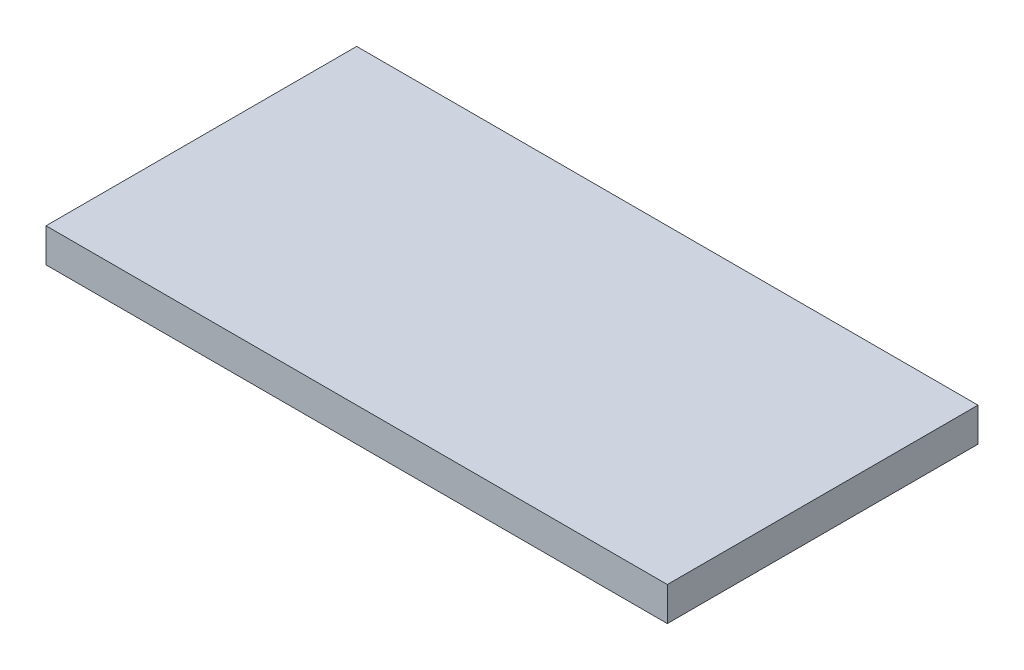
ISO-10303-21;
HEADER;
FILE_DESCRIPTION(('STEP AP214'),'2;1');
FILE_NAME('part.step','',(''),(''),'','','');
FILE_SCHEMA(('AUTOMOTIVE_DESIGN { 1 0 10303 214 1 1 1 1 }'));
ENDSEC;
DATA;
#1=APPLICATION_CONTEXT('core data for automotive mechanical design processes');
#2=APPLICATION_PROTOCOL_DEFINITION('international standard','automotive_design',2000,#1);
#3=PRODUCT_CONTEXT('',#1,'mechanical');
#4=PRODUCT('Part','Part','',(#3));
#5=PRODUCT_RELATED_PRODUCT_CATEGORY('part','',(#4));
#6=PRODUCT_DEFINITION_FORMATION('','',#4);
#7=PRODUCT_DEFINITION_CONTEXT('part definition',#1,'design');
#8=PRODUCT_DEFINITION('design','',#6,#7);
#9=PRODUCT_DEFINITION_SHAPE('','',#8);
#10=(LENGTH_UNIT() NAMED_UNIT(*) SI_UNIT(.MILLI.,.METRE.));
#11=(NAMED_UNIT(*) PLANE_ANGLE_UNIT() SI_UNIT($,.RADIAN.));
#12=(NAMED_UNIT(*) SI_UNIT($,.STERADIAN.) SOLID_ANGLE_UNIT());
#13=UNCERTAINTY_MEASURE_WITH_UNIT(LENGTH_MEASURE(1.E-05),#10,'distance_accuracy_value','');
#14=(GEOMETRIC_REPRESENTATION_CONTEXT(3) GLOBAL_UNCERTAINTY_ASSIGNED_CONTEXT((#13)) GLOBAL_UNIT_ASSIGNED_CONTEXT((#10,
#11,#12)) REPRESENTATION_CONTEXT('',''));
#15=CARTESIAN_POINT('',(0.,0.,0.));
#16=DIRECTION('',(0.,0.,1.));
#17=DIRECTION('',(1.,0.,0.));
#18=AXIS2_PLACEMENT_3D('',#15,#16,#17);
#19=CARTESIAN_POINT('',(-58.,6.3221055298656,-58.));
#20=DIRECTION('',(-1.,0.,0.));
#21=DIRECTION('',(0.,0.,1.));
#22=AXIS2_PLACEMENT_3D('',#19,#20,#21);
#23=PLANE('',#22);
#24=DIRECTION('',(0.,-1.,0.));
#25=VECTOR('',#24,1.);
#26=CARTESIAN_POINT('',(-58.,6.3221055298656,0.));
#27=LINE('',#26,#25);
#28=CARTESIAN_POINT('',(-58.,6.3221055298656,0.));
#29=VERTEX_POINT('',#28);
#30=CARTESIAN_POINT('',(-58.,0.,0.));
#31=VERTEX_POINT('',#30);
#32=EDGE_CURVE('E102',#29,#31,#27,.T.);
#33=ORIENTED_EDGE('',*,*,#32,.F.);
#34=DIRECTION('',(0.,0.,1.));
#35=VECTOR('',#34,1.);
#36=CARTESIAN_POINT('',(-58.,6.3221055298656,-58.));
#37=LINE('',#36,#35);
#38=CARTESIAN_POINT('',(-58.,6.3221055298656,-58.));
#39=VERTEX_POINT('',#38);
#40=EDGE_CURVE('E11',#39,#29,#37,.T.);
#41=ORIENTED_EDGE('',*,*,#40,.F.);
#42=DIRECTION('',(0.,-1.,0.));
#43=VECTOR('',#42,1.);
#44=CARTESIAN_POINT('',(-58.,6.3221055298656,-58.));
#45=LINE('',#44,#43);
#46=CARTESIAN_POINT('',(-58.,0.,-58.));
#47=VERTEX_POINT('',#46);
#48=EDGE_CURVE('E89',#39,#47,#45,.T.);
#49=ORIENTED_EDGE('',*,*,#48,.T.);
#50=DIRECTION('',(0.,0.,1.));
#51=VECTOR('',#50,1.);
#52=CARTESIAN_POINT('',(-58.,0.,-58.));
#53=LINE('',#52,#51);
#54=EDGE_CURVE('E41',#47,#31,#53,.T.);
#55=ORIENTED_EDGE('',*,*,#54,.T.);
#56=EDGE_LOOP('',(#33,#41,#49,#55));
#57=FACE_BOUND('',#56,.T.);
#58=ADVANCED_FACE('F38',(#57),#23,.T.);
#59=CARTESIAN_POINT('',(0.,6.3221055298656,-58.));
#60=DIRECTION('',(0.,1.,0.));
#61=DIRECTION('',(0.,0.,1.));
#62=AXIS2_PLACEMENT_3D('',#59,#60,#61);
#63=PLANE('',#62);
#64=DIRECTION('',(-1.,0.,0.));
#65=VECTOR('',#64,1.);
#66=CARTESIAN_POINT('',(0.,6.3221055298656,0.));
#67=LINE('',#66,#65);
#68=CARTESIAN_POINT('',(58.,6.32210552986561,0.));
#69=VERTEX_POINT('',#68);
#70=EDGE_CURVE('E69',#69,#29,#67,.T.);
#71=ORIENTED_EDGE('',*,*,#70,.F.);
#72=DIRECTION('',(0.,0.,1.));
#73=VECTOR('',#72,1.);
#74=CARTESIAN_POINT('',(58.,6.32210552986561,-58.));
#75=LINE('',#74,#73);
#76=CARTESIAN_POINT('',(58.,6.32210552986561,-58.));
#77=VERTEX_POINT('',#76);
#78=EDGE_CURVE('E47',#77,#69,#75,.T.);
#79=ORIENTED_EDGE('',*,*,#78,.F.);
#80=DIRECTION('',(-1.,0.,0.));
#81=VECTOR('',#80,1.);
#82=CARTESIAN_POINT('',(58.,6.32210552986561,-58.));
#83=LINE('',#82,#81);
#84=EDGE_CURVE('E55',#77,#39,#83,.T.);
#85=ORIENTED_EDGE('',*,*,#84,.T.);
#86=ORIENTED_EDGE('',*,*,#40,.T.);
#87=EDGE_LOOP('',(#71,#79,#85,#86));
#88=FACE_BOUND('',#87,.T.);
#89=ADVANCED_FACE('F113',(#88),#63,.T.);
#90=CARTESIAN_POINT('',(58.,0.,-58.));
#91=DIRECTION('',(1.,0.,0.));
#92=DIRECTION('',(0.,0.,-1.));
#93=AXIS2_PLACEMENT_3D('',#90,#91,#92);
#94=PLANE('',#93);
#95=DIRECTION('',(0.,1.,0.));
#96=VECTOR('',#95,1.);
#97=CARTESIAN_POINT('',(58.,0.,0.));
#98=LINE('',#97,#96);
#99=CARTESIAN_POINT('',(58.,0.,0.));
#100=VERTEX_POINT('',#99);
#101=EDGE_CURVE('E95',#100,#69,#98,.T.);
#102=ORIENTED_EDGE('',*,*,#101,.F.);
#103=DIRECTION('',(0.,0.,1.));
#104=VECTOR('',#103,1.);
#105=CARTESIAN_POINT('',(58.,0.,-58.));
#106=LINE('',#105,#104);
#107=CARTESIAN_POINT('',(58.,0.,-58.));
#108=VERTEX_POINT('',#107);
#109=EDGE_CURVE('E82',#108,#100,#106,.T.);
#110=ORIENTED_EDGE('',*,*,#109,.F.);
#111=DIRECTION('',(0.,1.,0.));
#112=VECTOR('',#111,1.);
#113=CARTESIAN_POINT('',(58.,0.,-58.));
#114=LINE('',#113,#112);
#115=EDGE_CURVE('E88',#108,#77,#114,.T.);
#116=ORIENTED_EDGE('',*,*,#115,.T.);
#117=ORIENTED_EDGE('',*,*,#78,.T.);
#118=EDGE_LOOP('',(#102,#110,#116,#117));
#119=FACE_BOUND('',#118,.T.);
#120=ADVANCED_FACE('F93',(#119),#94,.T.);
#121=CARTESIAN_POINT('',(0.,0.,-58.));
#122=DIRECTION('',(0.,-1.,0.));
#123=DIRECTION('',(0.,0.,-1.));
#124=AXIS2_PLACEMENT_3D('',#121,#122,#123);
#125=PLANE('',#124);
#126=DIRECTION('',(1.,0.,0.));
#127=VECTOR('',#126,1.);
#128=CARTESIAN_POINT('',(0.,0.,0.));
#129=LINE('',#128,#127);
#130=EDGE_CURVE('E105',#31,#100,#129,.T.);
#131=ORIENTED_EDGE('',*,*,#130,.F.);
#132=ORIENTED_EDGE('',*,*,#54,.F.);
#133=DIRECTION('',(1.,0.,0.));
#134=VECTOR('',#133,1.);
#135=CARTESIAN_POINT('',(-58.,0.,-58.));
#136=LINE('',#135,#134);
#137=EDGE_CURVE('E79',#47,#108,#136,.T.);
#138=ORIENTED_EDGE('',*,*,#137,.T.);
#139=ORIENTED_EDGE('',*,*,#109,.T.);
#140=EDGE_LOOP('',(#131,#132,#138,#139));
#141=FACE_BOUND('',#140,.T.);
#142=ADVANCED_FACE('F81',(#141),#125,.T.);
#143=CARTESIAN_POINT('',(0.,0.,-58.));
#144=DIRECTION('',(0.,0.,1.));
#145=DIRECTION('',(1.,0.,0.));
#146=AXIS2_PLACEMENT_3D('',#143,#144,#145);
#147=PLANE('',#146);
#148=ORIENTED_EDGE('',*,*,#48,.F.);
#149=ORIENTED_EDGE('',*,*,#84,.F.);
#150=ORIENTED_EDGE('',*,*,#115,.F.);
#151=ORIENTED_EDGE('',*,*,#137,.F.);
#152=EDGE_LOOP('',(#148,#149,#150,#151));
#153=FACE_BOUND('',#152,.T.);
#154=ADVANCED_FACE('F97',(#153),#147,.F.);
#155=CARTESIAN_POINT('',(0.,0.,0.));
#156=DIRECTION('',(0.,0.,1.));
#157=DIRECTION('',(1.,0.,0.));
#158=AXIS2_PLACEMENT_3D('',#155,#156,#157);
#159=PLANE('',#158);
#160=ORIENTED_EDGE('',*,*,#32,.T.);
#161=ORIENTED_EDGE('',*,*,#130,.T.);
#162=ORIENTED_EDGE('',*,*,#101,.T.);
#163=ORIENTED_EDGE('',*,*,#70,.T.);
#164=EDGE_LOOP('',(#160,#161,#162,#163));
#165=FACE_BOUND('',#164,.T.);
#166=ADVANCED_FACE('F110',(#165),#159,.T.);
#167=CLOSED_SHELL('',(#58,#89,#120,#142,#154,#166));
#168=MANIFOLD_SOLID_BREP('B2',#167);
#169=ADVANCED_BREP_SHAPE_REPRESENTATION('',(#18,#168),#14);
#170=SHAPE_DEFINITION_REPRESENTATION(#9,#169);
ENDSEC;
END-ISO-10303-21;
